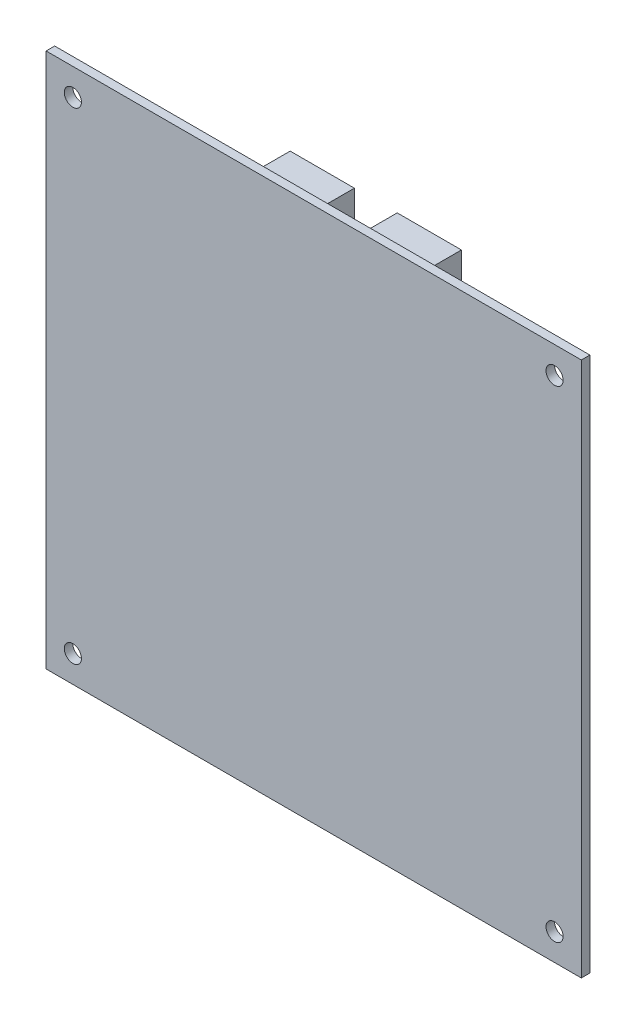
ISO-10303-21;
HEADER;
FILE_DESCRIPTION(('STEP AP214'),'2;1');
FILE_NAME('part.step','',(''),(''),'','','');
FILE_SCHEMA(('AUTOMOTIVE_DESIGN { 1 0 10303 214 1 1 1 1 }'));
ENDSEC;
DATA;
#1=APPLICATION_CONTEXT('core data for automotive mechanical design processes');
#2=APPLICATION_PROTOCOL_DEFINITION('international standard','automotive_design',2000,#1);
#3=PRODUCT_CONTEXT('',#1,'mechanical');
#4=PRODUCT('Part','Part','',(#3));
#5=PRODUCT_RELATED_PRODUCT_CATEGORY('part','',(#4));
#6=PRODUCT_DEFINITION_FORMATION('','',#4);
#7=PRODUCT_DEFINITION_CONTEXT('part definition',#1,'design');
#8=PRODUCT_DEFINITION('design','',#6,#7);
#9=PRODUCT_DEFINITION_SHAPE('','',#8);
#10=(LENGTH_UNIT() NAMED_UNIT(*) SI_UNIT(.MILLI.,.METRE.));
#11=(NAMED_UNIT(*) PLANE_ANGLE_UNIT() SI_UNIT($,.RADIAN.));
#12=(NAMED_UNIT(*) SI_UNIT($,.STERADIAN.) SOLID_ANGLE_UNIT());
#13=UNCERTAINTY_MEASURE_WITH_UNIT(LENGTH_MEASURE(1.E-05),#10,'distance_accuracy_value','');
#14=(GEOMETRIC_REPRESENTATION_CONTEXT(3) GLOBAL_UNCERTAINTY_ASSIGNED_CONTEXT((#13)) GLOBAL_UNIT_ASSIGNED_CONTEXT((#10,
#11,#12)) REPRESENTATION_CONTEXT('',''));
#15=CARTESIAN_POINT('',(0.,0.,0.));
#16=DIRECTION('',(0.,0.,1.));
#17=DIRECTION('',(1.,0.,0.));
#18=AXIS2_PLACEMENT_3D('',#15,#16,#17);
#19=CARTESIAN_POINT('',(0.,0.,0.));
#20=DIRECTION('',(0.,0.,1.));
#21=DIRECTION('',(1.,0.,0.));
#22=AXIS2_PLACEMENT_3D('',#19,#20,#21);
#23=PLANE('',#22);
#24=DIRECTION('',(0.,-1.,0.));
#25=VECTOR('',#24,1.);
#26=CARTESIAN_POINT('',(34.,95.,0.));
#27=LINE('',#26,#25);
#28=CARTESIAN_POINT('',(34.,95.,0.));
#29=VERTEX_POINT('',#28);
#30=CARTESIAN_POINT('',(34.,85.,0.));
#31=VERTEX_POINT('',#30);
#32=EDGE_CURVE('E259',#29,#31,#27,.T.);
#33=ORIENTED_EDGE('',*,*,#32,.T.);
#34=DIRECTION('',(1.,0.,0.));
#35=VECTOR('',#34,1.);
#36=CARTESIAN_POINT('',(34.,85.,0.));
#37=LINE('',#36,#35);
#38=CARTESIAN_POINT('',(46.,85.,0.));
#39=VERTEX_POINT('',#38);
#40=EDGE_CURVE('E261',#31,#39,#37,.T.);
#41=ORIENTED_EDGE('',*,*,#40,.T.);
#42=DIRECTION('',(0.,1.,0.));
#43=VECTOR('',#42,1.);
#44=CARTESIAN_POINT('',(46.,85.,0.));
#45=LINE('',#44,#43);
#46=CARTESIAN_POINT('',(46.,95.,0.));
#47=VERTEX_POINT('',#46);
#48=EDGE_CURVE('E262',#39,#47,#45,.T.);
#49=ORIENTED_EDGE('',*,*,#48,.T.);
#50=DIRECTION('',(-1.,0.,0.));
#51=VECTOR('',#50,1.);
#52=CARTESIAN_POINT('',(46.,95.,0.));
#53=LINE('',#52,#51);
#54=EDGE_CURVE('E266',#47,#29,#53,.T.);
#55=ORIENTED_EDGE('',*,*,#54,.T.);
#56=EDGE_LOOP('',(#33,#41,#49,#55));
#57=FACE_BOUND('',#56,.T.);
#58=DIRECTION('',(0.,-1.,0.));
#59=VECTOR('',#58,1.);
#60=CARTESIAN_POINT('',(34.,73.,0.));
#61=LINE('',#60,#59);
#62=CARTESIAN_POINT('',(34.,73.,0.));
#63=VERTEX_POINT('',#62);
#64=CARTESIAN_POINT('',(34.,26.,0.));
#65=VERTEX_POINT('',#64);
#66=EDGE_CURVE('E320',#63,#65,#61,.T.);
#67=ORIENTED_EDGE('',*,*,#66,.T.);
#68=DIRECTION('',(1.,0.,0.));
#69=VECTOR('',#68,1.);
#70=CARTESIAN_POINT('',(34.,26.,0.));
#71=LINE('',#70,#69);
#72=CARTESIAN_POINT('',(66.,26.,0.));
#73=VERTEX_POINT('',#72);
#74=EDGE_CURVE('E317',#65,#73,#71,.T.);
#75=ORIENTED_EDGE('',*,*,#74,.T.);
#76=DIRECTION('',(0.,1.,0.));
#77=VECTOR('',#76,1.);
#78=CARTESIAN_POINT('',(66.,26.,0.));
#79=LINE('',#78,#77);
#80=CARTESIAN_POINT('',(66.,73.,0.));
#81=VERTEX_POINT('',#80);
#82=EDGE_CURVE('E325',#73,#81,#79,.T.);
#83=ORIENTED_EDGE('',*,*,#82,.T.);
#84=DIRECTION('',(-1.,0.,0.));
#85=VECTOR('',#84,1.);
#86=CARTESIAN_POINT('',(66.,73.,0.));
#87=LINE('',#86,#85);
#88=EDGE_CURVE('E322',#81,#63,#87,.T.);
#89=ORIENTED_EDGE('',*,*,#88,.T.);
#90=EDGE_LOOP('',(#67,#75,#83,#89));
#91=FACE_BOUND('',#90,.T.);
#92=CARTESIAN_POINT('',(95.,95.,0.));
#93=DIRECTION('',(0.,0.,1.));
#94=DIRECTION('',(1.,0.,0.));
#95=AXIS2_PLACEMENT_3D('',#92,#93,#94);
#96=CIRCLE('',#95,1.6);
#97=CARTESIAN_POINT('',(96.6,95.,0.));
#98=VERTEX_POINT('',#97);
#99=EDGE_CURVE('E410',#98,#98,#96,.T.);
#100=ORIENTED_EDGE('',*,*,#99,.T.);
#101=EDGE_LOOP('',(#100));
#102=FACE_BOUND('',#101,.T.);
#103=CARTESIAN_POINT('',(5.,95.,0.));
#104=DIRECTION('',(0.,0.,1.));
#105=DIRECTION('',(1.,0.,0.));
#106=AXIS2_PLACEMENT_3D('',#103,#104,#105);
#107=CIRCLE('',#106,1.6);
#108=CARTESIAN_POINT('',(6.6,95.,0.));
#109=VERTEX_POINT('',#108);
#110=EDGE_CURVE('E411',#109,#109,#107,.T.);
#111=ORIENTED_EDGE('',*,*,#110,.T.);
#112=EDGE_LOOP('',(#111));
#113=FACE_BOUND('',#112,.T.);
#114=CARTESIAN_POINT('',(95.,5.,0.));
#115=DIRECTION('',(0.,0.,1.));
#116=DIRECTION('',(1.,0.,0.));
#117=AXIS2_PLACEMENT_3D('',#114,#115,#116);
#118=CIRCLE('',#117,1.6);
#119=CARTESIAN_POINT('',(96.6,5.,0.));
#120=VERTEX_POINT('',#119);
#121=EDGE_CURVE('E417',#120,#120,#118,.T.);
#122=ORIENTED_EDGE('',*,*,#121,.T.);
#123=EDGE_LOOP('',(#122));
#124=FACE_BOUND('',#123,.T.);
#125=CARTESIAN_POINT('',(5.,5.,0.));
#126=DIRECTION('',(0.,0.,1.));
#127=DIRECTION('',(1.,0.,0.));
#128=AXIS2_PLACEMENT_3D('',#125,#126,#127);
#129=CIRCLE('',#128,1.6);
#130=CARTESIAN_POINT('',(6.6,5.,0.));
#131=VERTEX_POINT('',#130);
#132=EDGE_CURVE('E421',#131,#131,#129,.T.);
#133=ORIENTED_EDGE('',*,*,#132,.T.);
#134=EDGE_LOOP('',(#133));
#135=FACE_BOUND('',#134,.T.);
#136=DIRECTION('',(0.,-1.,0.));
#137=VECTOR('',#136,1.);
#138=CARTESIAN_POINT('',(0.,100.,0.));
#139=LINE('',#138,#137);
#140=CARTESIAN_POINT('',(0.,100.,0.));
#141=VERTEX_POINT('',#140);
#142=CARTESIAN_POINT('',(0.,0.,0.));
#143=VERTEX_POINT('',#142);
#144=EDGE_CURVE('E427',#141,#143,#139,.T.);
#145=ORIENTED_EDGE('',*,*,#144,.F.);
#146=DIRECTION('',(-1.,0.,0.));
#147=VECTOR('',#146,1.);
#148=CARTESIAN_POINT('',(100.,100.,0.));
#149=LINE('',#148,#147);
#150=CARTESIAN_POINT('',(100.,100.,0.));
#151=VERTEX_POINT('',#150);
#152=EDGE_CURVE('E436',#151,#141,#149,.T.);
#153=ORIENTED_EDGE('',*,*,#152,.F.);
#154=DIRECTION('',(0.,1.,0.));
#155=VECTOR('',#154,1.);
#156=CARTESIAN_POINT('',(100.,0.,0.));
#157=LINE('',#156,#155);
#158=CARTESIAN_POINT('',(100.,0.,0.));
#159=VERTEX_POINT('',#158);
#160=EDGE_CURVE('E450',#159,#151,#157,.T.);
#161=ORIENTED_EDGE('',*,*,#160,.F.);
#162=DIRECTION('',(1.,0.,0.));
#163=VECTOR('',#162,1.);
#164=CARTESIAN_POINT('',(0.,0.,0.));
#165=LINE('',#164,#163);
#166=EDGE_CURVE('E443',#143,#159,#165,.T.);
#167=ORIENTED_EDGE('',*,*,#166,.F.);
#168=EDGE_LOOP('',(#145,#153,#161,#167));
#169=FACE_BOUND('',#168,.T.);
#170=DIRECTION('',(-1.,0.,0.));
#171=VECTOR('',#170,1.);
#172=CARTESIAN_POINT('',(30.,78.,0.));
#173=LINE('',#172,#171);
#174=CARTESIAN_POINT('',(30.,78.,0.));
#175=VERTEX_POINT('',#174);
#176=CARTESIAN_POINT('',(26.,78.,0.));
#177=VERTEX_POINT('',#176);
#178=EDGE_CURVE('E384',#175,#177,#173,.T.);
#179=ORIENTED_EDGE('',*,*,#178,.T.);
#180=DIRECTION('',(0.,-1.,0.));
#181=VECTOR('',#180,1.);
#182=CARTESIAN_POINT('',(26.,78.,0.));
#183=LINE('',#182,#181);
#184=CARTESIAN_POINT('',(26.,20.,0.));
#185=VERTEX_POINT('',#184);
#186=EDGE_CURVE('E374',#177,#185,#183,.T.);
#187=ORIENTED_EDGE('',*,*,#186,.T.);
#188=DIRECTION('',(1.,0.,0.));
#189=VECTOR('',#188,1.);
#190=CARTESIAN_POINT('',(26.,20.,0.));
#191=LINE('',#190,#189);
#192=CARTESIAN_POINT('',(30.,20.,0.));
#193=VERTEX_POINT('',#192);
#194=EDGE_CURVE('E378',#185,#193,#191,.T.);
#195=ORIENTED_EDGE('',*,*,#194,.T.);
#196=DIRECTION('',(0.,1.,0.));
#197=VECTOR('',#196,1.);
#198=CARTESIAN_POINT('',(30.,20.,0.));
#199=LINE('',#198,#197);
#200=EDGE_CURVE('E385',#193,#175,#199,.T.);
#201=ORIENTED_EDGE('',*,*,#200,.T.);
#202=EDGE_LOOP('',(#179,#187,#195,#201));
#203=FACE_BOUND('',#202,.T.);
#204=DIRECTION('',(0.,-1.,0.));
#205=VECTOR('',#204,1.);
#206=CARTESIAN_POINT('',(70.,78.,0.));
#207=LINE('',#206,#205);
#208=CARTESIAN_POINT('',(70.,78.,0.));
#209=VERTEX_POINT('',#208);
#210=CARTESIAN_POINT('',(70.,20.,0.));
#211=VERTEX_POINT('',#210);
#212=EDGE_CURVE('E347',#209,#211,#207,.T.);
#213=ORIENTED_EDGE('',*,*,#212,.T.);
#214=DIRECTION('',(1.,0.,0.));
#215=VECTOR('',#214,1.);
#216=CARTESIAN_POINT('',(70.,20.,0.));
#217=LINE('',#216,#215);
#218=CARTESIAN_POINT('',(74.,20.,0.));
#219=VERTEX_POINT('',#218);
#220=EDGE_CURVE('E346',#211,#219,#217,.T.);
#221=ORIENTED_EDGE('',*,*,#220,.T.);
#222=DIRECTION('',(0.,1.,0.));
#223=VECTOR('',#222,1.);
#224=CARTESIAN_POINT('',(74.,20.,0.));
#225=LINE('',#224,#223);
#226=CARTESIAN_POINT('',(74.,78.,0.));
#227=VERTEX_POINT('',#226);
#228=EDGE_CURVE('E352',#219,#227,#225,.T.);
#229=ORIENTED_EDGE('',*,*,#228,.T.);
#230=DIRECTION('',(-1.,0.,0.));
#231=VECTOR('',#230,1.);
#232=CARTESIAN_POINT('',(74.,78.,0.));
#233=LINE('',#232,#231);
#234=EDGE_CURVE('E353',#227,#209,#233,.T.);
#235=ORIENTED_EDGE('',*,*,#234,.T.);
#236=EDGE_LOOP('',(#213,#221,#229,#235));
#237=FACE_BOUND('',#236,.T.);
#238=DIRECTION('',(0.,-1.,0.));
#239=VECTOR('',#238,1.);
#240=CARTESIAN_POINT('',(40.,13.,0.));
#241=LINE('',#240,#239);
#242=CARTESIAN_POINT('',(40.,13.,0.));
#243=VERTEX_POINT('',#242);
#244=CARTESIAN_POINT('',(40.,3.,0.));
#245=VERTEX_POINT('',#244);
#246=EDGE_CURVE('E289',#243,#245,#241,.T.);
#247=ORIENTED_EDGE('',*,*,#246,.T.);
#248=DIRECTION('',(1.,0.,0.));
#249=VECTOR('',#248,1.);
#250=CARTESIAN_POINT('',(40.,3.,0.));
#251=LINE('',#250,#249);
#252=CARTESIAN_POINT('',(60.,3.,0.));
#253=VERTEX_POINT('',#252);
#254=EDGE_CURVE('E290',#245,#253,#251,.T.);
#255=ORIENTED_EDGE('',*,*,#254,.T.);
#256=DIRECTION('',(0.,1.,0.));
#257=VECTOR('',#256,1.);
#258=CARTESIAN_POINT('',(60.,3.,0.));
#259=LINE('',#258,#257);
#260=CARTESIAN_POINT('',(60.,13.,0.));
#261=VERTEX_POINT('',#260);
#262=EDGE_CURVE('E291',#253,#261,#259,.T.);
#263=ORIENTED_EDGE('',*,*,#262,.T.);
#264=DIRECTION('',(-1.,0.,0.));
#265=VECTOR('',#264,1.);
#266=CARTESIAN_POINT('',(60.,13.,0.));
#267=LINE('',#266,#265);
#268=EDGE_CURVE('E293',#261,#243,#267,.T.);
#269=ORIENTED_EDGE('',*,*,#268,.T.);
#270=EDGE_LOOP('',(#247,#255,#263,#269));
#271=FACE_BOUND('',#270,.T.);
#272=DIRECTION('',(0.,-1.,0.));
#273=VECTOR('',#272,1.);
#274=CARTESIAN_POINT('',(54.,95.,0.));
#275=LINE('',#274,#273);
#276=CARTESIAN_POINT('',(54.,95.,0.));
#277=VERTEX_POINT('',#276);
#278=CARTESIAN_POINT('',(54.,85.,0.));
#279=VERTEX_POINT('',#278);
#280=EDGE_CURVE('E57',#277,#279,#275,.T.);
#281=ORIENTED_EDGE('',*,*,#280,.T.);
#282=DIRECTION('',(1.,0.,0.));
#283=VECTOR('',#282,1.);
#284=CARTESIAN_POINT('',(54.,85.,0.));
#285=LINE('',#284,#283);
#286=CARTESIAN_POINT('',(66.,85.,0.));
#287=VERTEX_POINT('',#286);
#288=EDGE_CURVE('E58',#279,#287,#285,.T.);
#289=ORIENTED_EDGE('',*,*,#288,.T.);
#290=DIRECTION('',(0.,1.,0.));
#291=VECTOR('',#290,1.);
#292=CARTESIAN_POINT('',(66.,85.,0.));
#293=LINE('',#292,#291);
#294=CARTESIAN_POINT('',(66.,95.,0.));
#295=VERTEX_POINT('',#294);
#296=EDGE_CURVE('E225',#287,#295,#293,.T.);
#297=ORIENTED_EDGE('',*,*,#296,.T.);
#298=DIRECTION('',(-1.,0.,0.));
#299=VECTOR('',#298,1.);
#300=CARTESIAN_POINT('',(66.,95.,0.));
#301=LINE('',#300,#299);
#302=EDGE_CURVE('E223',#295,#277,#301,.T.);
#303=ORIENTED_EDGE('',*,*,#302,.T.);
#304=EDGE_LOOP('',(#281,#289,#297,#303));
#305=FACE_BOUND('',#304,.T.);
#306=ADVANCED_FACE('F41',(#57,#91,#102,#113,#124,#135,#169,#203,#237,#271,#305),#23,.F.);
#307=CARTESIAN_POINT('',(0.,0.,1.6));
#308=DIRECTION('',(0.,0.,1.));
#309=DIRECTION('',(1.,0.,0.));
#310=AXIS2_PLACEMENT_3D('',#307,#308,#309);
#311=PLANE('',#310);
#312=CARTESIAN_POINT('',(5.,95.,1.6));
#313=DIRECTION('',(0.,0.,1.));
#314=DIRECTION('',(1.,0.,0.));
#315=AXIS2_PLACEMENT_3D('',#312,#313,#314);
#316=CIRCLE('',#315,1.6);
#317=CARTESIAN_POINT('',(6.6,95.,1.6));
#318=VERTEX_POINT('',#317);
#319=EDGE_CURVE('E413',#318,#318,#316,.T.);
#320=ORIENTED_EDGE('',*,*,#319,.F.);
#321=EDGE_LOOP('',(#320));
#322=FACE_BOUND('',#321,.T.);
#323=CARTESIAN_POINT('',(5.,5.,1.6));
#324=DIRECTION('',(0.,0.,1.));
#325=DIRECTION('',(1.,0.,0.));
#326=AXIS2_PLACEMENT_3D('',#323,#324,#325);
#327=CIRCLE('',#326,1.6);
#328=CARTESIAN_POINT('',(6.6,5.,1.6));
#329=VERTEX_POINT('',#328);
#330=EDGE_CURVE('E426',#329,#329,#327,.T.);
#331=ORIENTED_EDGE('',*,*,#330,.F.);
#332=EDGE_LOOP('',(#331));
#333=FACE_BOUND('',#332,.T.);
#334=DIRECTION('',(0.,-1.,0.));
#335=VECTOR('',#334,1.);
#336=CARTESIAN_POINT('',(0.,100.,1.6));
#337=LINE('',#336,#335);
#338=CARTESIAN_POINT('',(0.,100.,1.6));
#339=VERTEX_POINT('',#338);
#340=CARTESIAN_POINT('',(0.,0.,1.6));
#341=VERTEX_POINT('',#340);
#342=EDGE_CURVE('E435',#339,#341,#337,.T.);
#343=ORIENTED_EDGE('',*,*,#342,.T.);
#344=DIRECTION('',(1.,0.,0.));
#345=VECTOR('',#344,1.);
#346=CARTESIAN_POINT('',(0.,0.,1.6));
#347=LINE('',#346,#345);
#348=CARTESIAN_POINT('',(100.,0.,1.6));
#349=VERTEX_POINT('',#348);
#350=EDGE_CURVE('E434',#341,#349,#347,.T.);
#351=ORIENTED_EDGE('',*,*,#350,.T.);
#352=DIRECTION('',(0.,1.,0.));
#353=VECTOR('',#352,1.);
#354=CARTESIAN_POINT('',(100.,0.,1.6));
#355=LINE('',#354,#353);
#356=CARTESIAN_POINT('',(100.,100.,1.6));
#357=VERTEX_POINT('',#356);
#358=EDGE_CURVE('E437',#349,#357,#355,.T.);
#359=ORIENTED_EDGE('',*,*,#358,.T.);
#360=DIRECTION('',(-1.,0.,0.));
#361=VECTOR('',#360,1.);
#362=CARTESIAN_POINT('',(100.,100.,1.6));
#363=LINE('',#362,#361);
#364=EDGE_CURVE('E439',#357,#339,#363,.T.);
#365=ORIENTED_EDGE('',*,*,#364,.T.);
#366=EDGE_LOOP('',(#343,#351,#359,#365));
#367=FACE_BOUND('',#366,.T.);
#368=CARTESIAN_POINT('',(95.,5.,1.6));
#369=DIRECTION('',(0.,0.,1.));
#370=DIRECTION('',(1.,0.,0.));
#371=AXIS2_PLACEMENT_3D('',#368,#369,#370);
#372=CIRCLE('',#371,1.6);
#373=CARTESIAN_POINT('',(96.6,5.,1.6));
#374=VERTEX_POINT('',#373);
#375=EDGE_CURVE('E419',#374,#374,#372,.T.);
#376=ORIENTED_EDGE('',*,*,#375,.F.);
#377=EDGE_LOOP('',(#376));
#378=FACE_BOUND('',#377,.T.);
#379=CARTESIAN_POINT('',(95.,95.,1.6));
#380=DIRECTION('',(0.,0.,1.));
#381=DIRECTION('',(1.,0.,0.));
#382=AXIS2_PLACEMENT_3D('',#379,#380,#381);
#383=CIRCLE('',#382,1.6);
#384=CARTESIAN_POINT('',(96.6,95.,1.6));
#385=VERTEX_POINT('',#384);
#386=EDGE_CURVE('E408',#385,#385,#383,.T.);
#387=ORIENTED_EDGE('',*,*,#386,.F.);
#388=EDGE_LOOP('',(#387));
#389=FACE_BOUND('',#388,.T.);
#390=ADVANCED_FACE('F475',(#322,#333,#367,#378,#389),#311,.T.);
#391=CARTESIAN_POINT('',(0.,100.,1.6));
#392=DIRECTION('',(1.,0.,0.));
#393=DIRECTION('',(0.,0.,-1.));
#394=AXIS2_PLACEMENT_3D('',#391,#392,#393);
#395=PLANE('',#394);
#396=ORIENTED_EDGE('',*,*,#144,.T.);
#397=DIRECTION('',(0.,0.,-1.));
#398=VECTOR('',#397,1.);
#399=CARTESIAN_POINT('',(0.,0.,1.6));
#400=LINE('',#399,#398);
#401=EDGE_CURVE('E11',#341,#143,#400,.T.);
#402=ORIENTED_EDGE('',*,*,#401,.F.);
#403=ORIENTED_EDGE('',*,*,#342,.F.);
#404=DIRECTION('',(0.,0.,-1.));
#405=VECTOR('',#404,1.);
#406=CARTESIAN_POINT('',(0.,100.,1.6));
#407=LINE('',#406,#405);
#408=EDGE_CURVE('E445',#339,#141,#407,.T.);
#409=ORIENTED_EDGE('',*,*,#408,.T.);
#410=EDGE_LOOP('',(#396,#402,#403,#409));
#411=FACE_BOUND('',#410,.T.);
#412=ADVANCED_FACE('F43',(#411),#395,.F.);
#413=CARTESIAN_POINT('',(0.,0.,1.6));
#414=DIRECTION('',(0.,1.,0.));
#415=DIRECTION('',(0.,0.,1.));
#416=AXIS2_PLACEMENT_3D('',#413,#414,#415);
#417=PLANE('',#416);
#418=ORIENTED_EDGE('',*,*,#166,.T.);
#419=DIRECTION('',(0.,0.,-1.));
#420=VECTOR('',#419,1.);
#421=CARTESIAN_POINT('',(100.,0.,1.6));
#422=LINE('',#421,#420);
#423=EDGE_CURVE('E47',#349,#159,#422,.T.);
#424=ORIENTED_EDGE('',*,*,#423,.F.);
#425=ORIENTED_EDGE('',*,*,#350,.F.);
#426=ORIENTED_EDGE('',*,*,#401,.T.);
#427=EDGE_LOOP('',(#418,#424,#425,#426));
#428=FACE_BOUND('',#427,.T.);
#429=ADVANCED_FACE('F478',(#428),#417,.F.);
#430=CARTESIAN_POINT('',(100.,0.,1.6));
#431=DIRECTION('',(-1.,0.,0.));
#432=DIRECTION('',(0.,0.,1.));
#433=AXIS2_PLACEMENT_3D('',#430,#431,#432);
#434=PLANE('',#433);
#435=ORIENTED_EDGE('',*,*,#160,.T.);
#436=DIRECTION('',(0.,0.,-1.));
#437=VECTOR('',#436,1.);
#438=CARTESIAN_POINT('',(100.,100.,1.6));
#439=LINE('',#438,#437);
#440=EDGE_CURVE('E452',#357,#151,#439,.T.);
#441=ORIENTED_EDGE('',*,*,#440,.F.);
#442=ORIENTED_EDGE('',*,*,#358,.F.);
#443=ORIENTED_EDGE('',*,*,#423,.T.);
#444=EDGE_LOOP('',(#435,#441,#442,#443));
#445=FACE_BOUND('',#444,.T.);
#446=ADVANCED_FACE('F459',(#445),#434,.F.);
#447=CARTESIAN_POINT('',(100.,100.,1.6));
#448=DIRECTION('',(0.,-1.,0.));
#449=DIRECTION('',(0.,0.,-1.));
#450=AXIS2_PLACEMENT_3D('',#447,#448,#449);
#451=PLANE('',#450);
#452=ORIENTED_EDGE('',*,*,#152,.T.);
#453=ORIENTED_EDGE('',*,*,#408,.F.);
#454=ORIENTED_EDGE('',*,*,#364,.F.);
#455=ORIENTED_EDGE('',*,*,#440,.T.);
#456=EDGE_LOOP('',(#452,#453,#454,#455));
#457=FACE_BOUND('',#456,.T.);
#458=ADVANCED_FACE('F469',(#457),#451,.F.);
#459=CARTESIAN_POINT('',(5.,5.,1.6));
#460=DIRECTION('',(0.,0.,-1.));
#461=DIRECTION('',(-1.,0.,0.));
#462=AXIS2_PLACEMENT_3D('',#459,#460,#461);
#463=CYLINDRICAL_SURFACE('',#462,1.6);
#464=ORIENTED_EDGE('',*,*,#330,.T.);
#465=EDGE_LOOP('',(#464));
#466=FACE_BOUND('',#465,.T.);
#467=ORIENTED_EDGE('',*,*,#132,.F.);
#468=EDGE_LOOP('',(#467));
#469=FACE_BOUND('',#468,.T.);
#470=ADVANCED_FACE('F500',(#466,#469),#463,.F.);
#471=CARTESIAN_POINT('',(95.,5.,1.6));
#472=DIRECTION('',(0.,0.,-1.));
#473=DIRECTION('',(-1.,0.,0.));
#474=AXIS2_PLACEMENT_3D('',#471,#472,#473);
#475=CYLINDRICAL_SURFACE('',#474,1.6);
#476=ORIENTED_EDGE('',*,*,#375,.T.);
#477=EDGE_LOOP('',(#476));
#478=FACE_BOUND('',#477,.T.);
#479=ORIENTED_EDGE('',*,*,#121,.F.);
#480=EDGE_LOOP('',(#479));
#481=FACE_BOUND('',#480,.T.);
#482=ADVANCED_FACE('F502',(#478,#481),#475,.F.);
#483=CARTESIAN_POINT('',(5.,95.,1.6));
#484=DIRECTION('',(0.,0.,-1.));
#485=DIRECTION('',(-1.,0.,0.));
#486=AXIS2_PLACEMENT_3D('',#483,#484,#485);
#487=CYLINDRICAL_SURFACE('',#486,1.6);
#488=ORIENTED_EDGE('',*,*,#319,.T.);
#489=EDGE_LOOP('',(#488));
#490=FACE_BOUND('',#489,.T.);
#491=ORIENTED_EDGE('',*,*,#110,.F.);
#492=EDGE_LOOP('',(#491));
#493=FACE_BOUND('',#492,.T.);
#494=ADVANCED_FACE('F506',(#490,#493),#487,.F.);
#495=CARTESIAN_POINT('',(95.,95.,1.6));
#496=DIRECTION('',(0.,0.,-1.));
#497=DIRECTION('',(-1.,0.,0.));
#498=AXIS2_PLACEMENT_3D('',#495,#496,#497);
#499=CYLINDRICAL_SURFACE('',#498,1.6);
#500=ORIENTED_EDGE('',*,*,#386,.T.);
#501=EDGE_LOOP('',(#500));
#502=FACE_BOUND('',#501,.T.);
#503=ORIENTED_EDGE('',*,*,#99,.F.);
#504=EDGE_LOOP('',(#503));
#505=FACE_BOUND('',#504,.T.);
#506=ADVANCED_FACE('F511',(#502,#505),#499,.F.);
#507=CARTESIAN_POINT('',(26.,78.,0.));
#508=DIRECTION('',(1.,0.,0.));
#509=DIRECTION('',(0.,0.,-1.));
#510=AXIS2_PLACEMENT_3D('',#507,#508,#509);
#511=PLANE('',#510);
#512=DIRECTION('',(0.,-1.,0.));
#513=VECTOR('',#512,1.);
#514=CARTESIAN_POINT('',(26.,78.,-8.));
#515=LINE('',#514,#513);
#516=CARTESIAN_POINT('',(26.,78.,-8.));
#517=VERTEX_POINT('',#516);
#518=CARTESIAN_POINT('',(26.,20.,-8.));
#519=VERTEX_POINT('',#518);
#520=EDGE_CURVE('E372',#517,#519,#515,.T.);
#521=ORIENTED_EDGE('',*,*,#520,.T.);
#522=DIRECTION('',(0.,0.,-1.));
#523=VECTOR('',#522,1.);
#524=CARTESIAN_POINT('',(26.,20.,0.));
#525=LINE('',#524,#523);
#526=EDGE_CURVE('E404',#185,#519,#525,.T.);
#527=ORIENTED_EDGE('',*,*,#526,.F.);
#528=ORIENTED_EDGE('',*,*,#186,.F.);
#529=DIRECTION('',(0.,0.,-1.));
#530=VECTOR('',#529,1.);
#531=CARTESIAN_POINT('',(26.,78.,0.));
#532=LINE('',#531,#530);
#533=EDGE_CURVE('E389',#177,#517,#532,.T.);
#534=ORIENTED_EDGE('',*,*,#533,.T.);
#535=EDGE_LOOP('',(#521,#527,#528,#534));
#536=FACE_BOUND('',#535,.T.);
#537=ADVANCED_FACE('F520',(#536),#511,.F.);
#538=CARTESIAN_POINT('',(26.,20.,0.));
#539=DIRECTION('',(0.,1.,0.));
#540=DIRECTION('',(0.,0.,1.));
#541=AXIS2_PLACEMENT_3D('',#538,#539,#540);
#542=PLANE('',#541);
#543=DIRECTION('',(1.,0.,0.));
#544=VECTOR('',#543,1.);
#545=CARTESIAN_POINT('',(26.,20.,-8.));
#546=LINE('',#545,#544);
#547=CARTESIAN_POINT('',(30.,20.,-8.));
#548=VERTEX_POINT('',#547);
#549=EDGE_CURVE('E392',#519,#548,#546,.T.);
#550=ORIENTED_EDGE('',*,*,#549,.T.);
#551=DIRECTION('',(0.,0.,-1.));
#552=VECTOR('',#551,1.);
#553=CARTESIAN_POINT('',(30.,20.,0.));
#554=LINE('',#553,#552);
#555=EDGE_CURVE('E402',#193,#548,#554,.T.);
#556=ORIENTED_EDGE('',*,*,#555,.F.);
#557=ORIENTED_EDGE('',*,*,#194,.F.);
#558=ORIENTED_EDGE('',*,*,#526,.T.);
#559=EDGE_LOOP('',(#550,#556,#557,#558));
#560=FACE_BOUND('',#559,.T.);
#561=ADVANCED_FACE('F521',(#560),#542,.F.);
#562=CARTESIAN_POINT('',(30.,20.,0.));
#563=DIRECTION('',(-1.,0.,0.));
#564=DIRECTION('',(0.,0.,1.));
#565=AXIS2_PLACEMENT_3D('',#562,#563,#564);
#566=PLANE('',#565);
#567=DIRECTION('',(0.,1.,0.));
#568=VECTOR('',#567,1.);
#569=CARTESIAN_POINT('',(30.,20.,-8.));
#570=LINE('',#569,#568);
#571=CARTESIAN_POINT('',(30.,78.,-8.));
#572=VERTEX_POINT('',#571);
#573=EDGE_CURVE('E393',#548,#572,#570,.T.);
#574=ORIENTED_EDGE('',*,*,#573,.T.);
#575=DIRECTION('',(0.,0.,-1.));
#576=VECTOR('',#575,1.);
#577=CARTESIAN_POINT('',(30.,78.,0.));
#578=LINE('',#577,#576);
#579=EDGE_CURVE('E399',#175,#572,#578,.T.);
#580=ORIENTED_EDGE('',*,*,#579,.F.);
#581=ORIENTED_EDGE('',*,*,#200,.F.);
#582=ORIENTED_EDGE('',*,*,#555,.T.);
#583=EDGE_LOOP('',(#574,#580,#581,#582));
#584=FACE_BOUND('',#583,.T.);
#585=ADVANCED_FACE('F525',(#584),#566,.F.);
#586=CARTESIAN_POINT('',(30.,78.,0.));
#587=DIRECTION('',(0.,-1.,0.));
#588=DIRECTION('',(0.,0.,-1.));
#589=AXIS2_PLACEMENT_3D('',#586,#587,#588);
#590=PLANE('',#589);
#591=DIRECTION('',(-1.,0.,0.));
#592=VECTOR('',#591,1.);
#593=CARTESIAN_POINT('',(30.,78.,-8.));
#594=LINE('',#593,#592);
#595=EDGE_CURVE('E377',#572,#517,#594,.T.);
#596=ORIENTED_EDGE('',*,*,#595,.T.);
#597=ORIENTED_EDGE('',*,*,#533,.F.);
#598=ORIENTED_EDGE('',*,*,#178,.F.);
#599=ORIENTED_EDGE('',*,*,#579,.T.);
#600=EDGE_LOOP('',(#596,#597,#598,#599));
#601=FACE_BOUND('',#600,.T.);
#602=ADVANCED_FACE('F530',(#601),#590,.F.);
#603=CARTESIAN_POINT('',(0.,0.,-8.));
#604=DIRECTION('',(0.,0.,1.));
#605=DIRECTION('',(1.,0.,0.));
#606=AXIS2_PLACEMENT_3D('',#603,#604,#605);
#607=PLANE('',#606);
#608=ORIENTED_EDGE('',*,*,#520,.F.);
#609=ORIENTED_EDGE('',*,*,#595,.F.);
#610=ORIENTED_EDGE('',*,*,#573,.F.);
#611=ORIENTED_EDGE('',*,*,#549,.F.);
#612=EDGE_LOOP('',(#608,#609,#610,#611));
#613=FACE_BOUND('',#612,.T.);
#614=ADVANCED_FACE('F531',(#613),#607,.F.);
#615=CARTESIAN_POINT('',(70.,78.,0.));
#616=DIRECTION('',(1.,0.,0.));
#617=DIRECTION('',(0.,0.,-1.));
#618=AXIS2_PLACEMENT_3D('',#615,#616,#617);
#619=PLANE('',#618);
#620=DIRECTION('',(0.,-1.,0.));
#621=VECTOR('',#620,1.);
#622=CARTESIAN_POINT('',(70.,78.,-8.));
#623=LINE('',#622,#621);
#624=CARTESIAN_POINT('',(70.,78.,-8.));
#625=VERTEX_POINT('',#624);
#626=CARTESIAN_POINT('',(70.,20.,-8.));
#627=VERTEX_POINT('',#626);
#628=EDGE_CURVE('E345',#625,#627,#623,.T.);
#629=ORIENTED_EDGE('',*,*,#628,.T.);
#630=DIRECTION('',(0.,0.,-1.));
#631=VECTOR('',#630,1.);
#632=CARTESIAN_POINT('',(70.,20.,0.));
#633=LINE('',#632,#631);
#634=EDGE_CURVE('E371',#211,#627,#633,.T.);
#635=ORIENTED_EDGE('',*,*,#634,.F.);
#636=ORIENTED_EDGE('',*,*,#212,.F.);
#637=DIRECTION('',(0.,0.,-1.));
#638=VECTOR('',#637,1.);
#639=CARTESIAN_POINT('',(70.,78.,0.));
#640=LINE('',#639,#638);
#641=EDGE_CURVE('E351',#209,#625,#640,.T.);
#642=ORIENTED_EDGE('',*,*,#641,.T.);
#643=EDGE_LOOP('',(#629,#635,#636,#642));
#644=FACE_BOUND('',#643,.T.);
#645=ADVANCED_FACE('F540',(#644),#619,.F.);
#646=CARTESIAN_POINT('',(70.,20.,0.));
#647=DIRECTION('',(0.,1.,0.));
#648=DIRECTION('',(0.,0.,1.));
#649=AXIS2_PLACEMENT_3D('',#646,#647,#648);
#650=PLANE('',#649);
#651=DIRECTION('',(1.,0.,0.));
#652=VECTOR('',#651,1.);
#653=CARTESIAN_POINT('',(70.,20.,-8.));
#654=LINE('',#653,#652);
#655=CARTESIAN_POINT('',(74.,20.,-8.));
#656=VERTEX_POINT('',#655);
#657=EDGE_CURVE('E359',#627,#656,#654,.T.);
#658=ORIENTED_EDGE('',*,*,#657,.T.);
#659=DIRECTION('',(0.,0.,-1.));
#660=VECTOR('',#659,1.);
#661=CARTESIAN_POINT('',(74.,20.,0.));
#662=LINE('',#661,#660);
#663=EDGE_CURVE('E366',#219,#656,#662,.T.);
#664=ORIENTED_EDGE('',*,*,#663,.F.);
#665=ORIENTED_EDGE('',*,*,#220,.F.);
#666=ORIENTED_EDGE('',*,*,#634,.T.);
#667=EDGE_LOOP('',(#658,#664,#665,#666));
#668=FACE_BOUND('',#667,.T.);
#669=ADVANCED_FACE('F541',(#668),#650,.F.);
#670=CARTESIAN_POINT('',(74.,20.,0.));
#671=DIRECTION('',(-1.,0.,0.));
#672=DIRECTION('',(0.,0.,1.));
#673=AXIS2_PLACEMENT_3D('',#670,#671,#672);
#674=PLANE('',#673);
#675=DIRECTION('',(0.,1.,0.));
#676=VECTOR('',#675,1.);
#677=CARTESIAN_POINT('',(74.,20.,-8.));
#678=LINE('',#677,#676);
#679=CARTESIAN_POINT('',(74.,78.,-8.));
#680=VERTEX_POINT('',#679);
#681=EDGE_CURVE('E360',#656,#680,#678,.T.);
#682=ORIENTED_EDGE('',*,*,#681,.T.);
#683=DIRECTION('',(0.,0.,-1.));
#684=VECTOR('',#683,1.);
#685=CARTESIAN_POINT('',(74.,78.,0.));
#686=LINE('',#685,#684);
#687=EDGE_CURVE('E364',#227,#680,#686,.T.);
#688=ORIENTED_EDGE('',*,*,#687,.F.);
#689=ORIENTED_EDGE('',*,*,#228,.F.);
#690=ORIENTED_EDGE('',*,*,#663,.T.);
#691=EDGE_LOOP('',(#682,#688,#689,#690));
#692=FACE_BOUND('',#691,.T.);
#693=ADVANCED_FACE('F544',(#692),#674,.F.);
#694=CARTESIAN_POINT('',(74.,78.,0.));
#695=DIRECTION('',(0.,-1.,0.));
#696=DIRECTION('',(0.,0.,-1.));
#697=AXIS2_PLACEMENT_3D('',#694,#695,#696);
#698=PLANE('',#697);
#699=DIRECTION('',(-1.,0.,0.));
#700=VECTOR('',#699,1.);
#701=CARTESIAN_POINT('',(74.,78.,-8.));
#702=LINE('',#701,#700);
#703=EDGE_CURVE('E349',#680,#625,#702,.T.);
#704=ORIENTED_EDGE('',*,*,#703,.T.);
#705=ORIENTED_EDGE('',*,*,#641,.F.);
#706=ORIENTED_EDGE('',*,*,#234,.F.);
#707=ORIENTED_EDGE('',*,*,#687,.T.);
#708=EDGE_LOOP('',(#704,#705,#706,#707));
#709=FACE_BOUND('',#708,.T.);
#710=ADVANCED_FACE('F548',(#709),#698,.F.);
#711=CARTESIAN_POINT('',(0.,0.,-8.));
#712=DIRECTION('',(0.,0.,1.));
#713=DIRECTION('',(1.,0.,0.));
#714=AXIS2_PLACEMENT_3D('',#711,#712,#713);
#715=PLANE('',#714);
#716=ORIENTED_EDGE('',*,*,#628,.F.);
#717=ORIENTED_EDGE('',*,*,#703,.F.);
#718=ORIENTED_EDGE('',*,*,#681,.F.);
#719=ORIENTED_EDGE('',*,*,#657,.F.);
#720=EDGE_LOOP('',(#716,#717,#718,#719));
#721=FACE_BOUND('',#720,.T.);
#722=ADVANCED_FACE('F554',(#721),#715,.F.);
#723=CARTESIAN_POINT('',(34.,73.,0.));
#724=DIRECTION('',(1.,0.,0.));
#725=DIRECTION('',(0.,0.,-1.));
#726=AXIS2_PLACEMENT_3D('',#723,#724,#725);
#727=PLANE('',#726);
#728=DIRECTION('',(0.,-1.,0.));
#729=VECTOR('',#728,1.);
#730=CARTESIAN_POINT('',(34.,73.,-16.));
#731=LINE('',#730,#729);
#732=CARTESIAN_POINT('',(34.,73.,-16.));
#733=VERTEX_POINT('',#732);
#734=CARTESIAN_POINT('',(34.,26.,-16.));
#735=VERTEX_POINT('',#734);
#736=EDGE_CURVE('E316',#733,#735,#731,.T.);
#737=ORIENTED_EDGE('',*,*,#736,.T.);
#738=DIRECTION('',(0.,0.,-1.));
#739=VECTOR('',#738,1.);
#740=CARTESIAN_POINT('',(34.,26.,0.));
#741=LINE('',#740,#739);
#742=EDGE_CURVE('E342',#65,#735,#741,.T.);
#743=ORIENTED_EDGE('',*,*,#742,.F.);
#744=ORIENTED_EDGE('',*,*,#66,.F.);
#745=DIRECTION('',(0.,0.,-1.));
#746=VECTOR('',#745,1.);
#747=CARTESIAN_POINT('',(34.,73.,0.));
#748=LINE('',#747,#746);
#749=EDGE_CURVE('E326',#63,#733,#748,.T.);
#750=ORIENTED_EDGE('',*,*,#749,.T.);
#751=EDGE_LOOP('',(#737,#743,#744,#750));
#752=FACE_BOUND('',#751,.T.);
#753=ADVANCED_FACE('F560',(#752),#727,.F.);
#754=CARTESIAN_POINT('',(34.,26.,0.));
#755=DIRECTION('',(0.,1.,0.));
#756=DIRECTION('',(0.,0.,1.));
#757=AXIS2_PLACEMENT_3D('',#754,#755,#756);
#758=PLANE('',#757);
#759=DIRECTION('',(1.,0.,0.));
#760=VECTOR('',#759,1.);
#761=CARTESIAN_POINT('',(34.,26.,-16.));
#762=LINE('',#761,#760);
#763=CARTESIAN_POINT('',(66.,26.,-16.));
#764=VERTEX_POINT('',#763);
#765=EDGE_CURVE('E328',#735,#764,#762,.T.);
#766=ORIENTED_EDGE('',*,*,#765,.T.);
#767=DIRECTION('',(0.,0.,-1.));
#768=VECTOR('',#767,1.);
#769=CARTESIAN_POINT('',(66.,26.,0.));
#770=LINE('',#769,#768);
#771=EDGE_CURVE('E339',#73,#764,#770,.T.);
#772=ORIENTED_EDGE('',*,*,#771,.F.);
#773=ORIENTED_EDGE('',*,*,#74,.F.);
#774=ORIENTED_EDGE('',*,*,#742,.T.);
#775=EDGE_LOOP('',(#766,#772,#773,#774));
#776=FACE_BOUND('',#775,.T.);
#777=ADVANCED_FACE('F561',(#776),#758,.F.);
#778=CARTESIAN_POINT('',(66.,26.,0.));
#779=DIRECTION('',(-1.,0.,0.));
#780=DIRECTION('',(0.,0.,1.));
#781=AXIS2_PLACEMENT_3D('',#778,#779,#780);
#782=PLANE('',#781);
#783=DIRECTION('',(0.,1.,0.));
#784=VECTOR('',#783,1.);
#785=CARTESIAN_POINT('',(66.,26.,-16.));
#786=LINE('',#785,#784);
#787=CARTESIAN_POINT('',(66.,73.,-16.));
#788=VERTEX_POINT('',#787);
#789=EDGE_CURVE('E332',#764,#788,#786,.T.);
#790=ORIENTED_EDGE('',*,*,#789,.T.);
#791=DIRECTION('',(0.,0.,-1.));
#792=VECTOR('',#791,1.);
#793=CARTESIAN_POINT('',(66.,73.,0.));
#794=LINE('',#793,#792);
#795=EDGE_CURVE('E337',#81,#788,#794,.T.);
#796=ORIENTED_EDGE('',*,*,#795,.F.);
#797=ORIENTED_EDGE('',*,*,#82,.F.);
#798=ORIENTED_EDGE('',*,*,#771,.T.);
#799=EDGE_LOOP('',(#790,#796,#797,#798));
#800=FACE_BOUND('',#799,.T.);
#801=ADVANCED_FACE('F565',(#800),#782,.F.);
#802=CARTESIAN_POINT('',(66.,73.,0.));
#803=DIRECTION('',(0.,-1.,0.));
#804=DIRECTION('',(0.,0.,-1.));
#805=AXIS2_PLACEMENT_3D('',#802,#803,#804);
#806=PLANE('',#805);
#807=DIRECTION('',(-1.,0.,0.));
#808=VECTOR('',#807,1.);
#809=CARTESIAN_POINT('',(66.,73.,-16.));
#810=LINE('',#809,#808);
#811=EDGE_CURVE('E319',#788,#733,#810,.T.);
#812=ORIENTED_EDGE('',*,*,#811,.T.);
#813=ORIENTED_EDGE('',*,*,#749,.F.);
#814=ORIENTED_EDGE('',*,*,#88,.F.);
#815=ORIENTED_EDGE('',*,*,#795,.T.);
#816=EDGE_LOOP('',(#812,#813,#814,#815));
#817=FACE_BOUND('',#816,.T.);
#818=ADVANCED_FACE('F569',(#817),#806,.F.);
#819=CARTESIAN_POINT('',(0.,0.,-16.));
#820=DIRECTION('',(0.,0.,1.));
#821=DIRECTION('',(1.,0.,0.));
#822=AXIS2_PLACEMENT_3D('',#819,#820,#821);
#823=PLANE('',#822);
#824=ORIENTED_EDGE('',*,*,#736,.F.);
#825=ORIENTED_EDGE('',*,*,#811,.F.);
#826=ORIENTED_EDGE('',*,*,#789,.F.);
#827=ORIENTED_EDGE('',*,*,#765,.F.);
#828=EDGE_LOOP('',(#824,#825,#826,#827));
#829=FACE_BOUND('',#828,.T.);
#830=ADVANCED_FACE('F573',(#829),#823,.F.);
#831=CARTESIAN_POINT('',(40.,13.,0.));
#832=DIRECTION('',(1.,0.,0.));
#833=DIRECTION('',(0.,0.,-1.));
#834=AXIS2_PLACEMENT_3D('',#831,#832,#833);
#835=PLANE('',#834);
#836=DIRECTION('',(0.,-1.,0.));
#837=VECTOR('',#836,1.);
#838=CARTESIAN_POINT('',(40.,13.,-12.));
#839=LINE('',#838,#837);
#840=CARTESIAN_POINT('',(40.,13.,-12.));
#841=VERTEX_POINT('',#840);
#842=CARTESIAN_POINT('',(40.,3.,-12.));
#843=VERTEX_POINT('',#842);
#844=EDGE_CURVE('E287',#841,#843,#839,.T.);
#845=ORIENTED_EDGE('',*,*,#844,.T.);
#846=DIRECTION('',(0.,0.,-1.));
#847=VECTOR('',#846,1.);
#848=CARTESIAN_POINT('',(40.,3.,0.));
#849=LINE('',#848,#847);
#850=EDGE_CURVE('E311',#245,#843,#849,.T.);
#851=ORIENTED_EDGE('',*,*,#850,.F.);
#852=ORIENTED_EDGE('',*,*,#246,.F.);
#853=DIRECTION('',(0.,0.,-1.));
#854=VECTOR('',#853,1.);
#855=CARTESIAN_POINT('',(40.,13.,0.));
#856=LINE('',#855,#854);
#857=EDGE_CURVE('E300',#243,#841,#856,.T.);
#858=ORIENTED_EDGE('',*,*,#857,.T.);
#859=EDGE_LOOP('',(#845,#851,#852,#858));
#860=FACE_BOUND('',#859,.T.);
#861=ADVANCED_FACE('F577',(#860),#835,.F.);
#862=CARTESIAN_POINT('',(40.,3.,0.));
#863=DIRECTION('',(0.,1.,0.));
#864=DIRECTION('',(0.,0.,1.));
#865=AXIS2_PLACEMENT_3D('',#862,#863,#864);
#866=PLANE('',#865);
#867=DIRECTION('',(1.,0.,0.));
#868=VECTOR('',#867,1.);
#869=CARTESIAN_POINT('',(40.,3.,-12.));
#870=LINE('',#869,#868);
#871=CARTESIAN_POINT('',(60.,3.,-12.));
#872=VERTEX_POINT('',#871);
#873=EDGE_CURVE('E296',#843,#872,#870,.T.);
#874=ORIENTED_EDGE('',*,*,#873,.T.);
#875=DIRECTION('',(0.,0.,-1.));
#876=VECTOR('',#875,1.);
#877=CARTESIAN_POINT('',(60.,3.,0.));
#878=LINE('',#877,#876);
#879=EDGE_CURVE('E309',#253,#872,#878,.T.);
#880=ORIENTED_EDGE('',*,*,#879,.F.);
#881=ORIENTED_EDGE('',*,*,#254,.F.);
#882=ORIENTED_EDGE('',*,*,#850,.T.);
#883=EDGE_LOOP('',(#874,#880,#881,#882));
#884=FACE_BOUND('',#883,.T.);
#885=ADVANCED_FACE('F583',(#884),#866,.F.);
#886=CARTESIAN_POINT('',(60.,3.,0.));
#887=DIRECTION('',(-1.,0.,0.));
#888=DIRECTION('',(0.,0.,1.));
#889=AXIS2_PLACEMENT_3D('',#886,#887,#888);
#890=PLANE('',#889);
#891=DIRECTION('',(0.,1.,0.));
#892=VECTOR('',#891,1.);
#893=CARTESIAN_POINT('',(60.,3.,-12.));
#894=LINE('',#893,#892);
#895=CARTESIAN_POINT('',(60.,13.,-12.));
#896=VERTEX_POINT('',#895);
#897=EDGE_CURVE('E302',#872,#896,#894,.T.);
#898=ORIENTED_EDGE('',*,*,#897,.T.);
#899=DIRECTION('',(0.,0.,-1.));
#900=VECTOR('',#899,1.);
#901=CARTESIAN_POINT('',(60.,13.,0.));
#902=LINE('',#901,#900);
#903=EDGE_CURVE('E307',#261,#896,#902,.T.);
#904=ORIENTED_EDGE('',*,*,#903,.F.);
#905=ORIENTED_EDGE('',*,*,#262,.F.);
#906=ORIENTED_EDGE('',*,*,#879,.T.);
#907=EDGE_LOOP('',(#898,#904,#905,#906));
#908=FACE_BOUND('',#907,.T.);
#909=ADVANCED_FACE('F584',(#908),#890,.F.);
#910=CARTESIAN_POINT('',(60.,13.,0.));
#911=DIRECTION('',(0.,-1.,0.));
#912=DIRECTION('',(0.,0.,-1.));
#913=AXIS2_PLACEMENT_3D('',#910,#911,#912);
#914=PLANE('',#913);
#915=DIRECTION('',(-1.,0.,0.));
#916=VECTOR('',#915,1.);
#917=CARTESIAN_POINT('',(60.,13.,-12.));
#918=LINE('',#917,#916);
#919=EDGE_CURVE('E292',#896,#841,#918,.T.);
#920=ORIENTED_EDGE('',*,*,#919,.T.);
#921=ORIENTED_EDGE('',*,*,#857,.F.);
#922=ORIENTED_EDGE('',*,*,#268,.F.);
#923=ORIENTED_EDGE('',*,*,#903,.T.);
#924=EDGE_LOOP('',(#920,#921,#922,#923));
#925=FACE_BOUND('',#924,.T.);
#926=ADVANCED_FACE('F589',(#925),#914,.F.);
#927=CARTESIAN_POINT('',(0.,0.,-12.));
#928=DIRECTION('',(0.,0.,1.));
#929=DIRECTION('',(1.,0.,0.));
#930=AXIS2_PLACEMENT_3D('',#927,#928,#929);
#931=PLANE('',#930);
#932=ORIENTED_EDGE('',*,*,#844,.F.);
#933=ORIENTED_EDGE('',*,*,#919,.F.);
#934=ORIENTED_EDGE('',*,*,#897,.F.);
#935=ORIENTED_EDGE('',*,*,#873,.F.);
#936=EDGE_LOOP('',(#932,#933,#934,#935));
#937=FACE_BOUND('',#936,.T.);
#938=ADVANCED_FACE('F593',(#937),#931,.F.);
#939=CARTESIAN_POINT('',(34.,95.,0.));
#940=DIRECTION('',(1.,0.,0.));
#941=DIRECTION('',(0.,0.,-1.));
#942=AXIS2_PLACEMENT_3D('',#939,#940,#941);
#943=PLANE('',#942);
#944=DIRECTION('',(0.,-1.,0.));
#945=VECTOR('',#944,1.);
#946=CARTESIAN_POINT('',(34.,95.,-10.));
#947=LINE('',#946,#945);
#948=CARTESIAN_POINT('',(34.,95.,-10.));
#949=VERTEX_POINT('',#948);
#950=CARTESIAN_POINT('',(34.,85.,-10.));
#951=VERTEX_POINT('',#950);
#952=EDGE_CURVE('E256',#949,#951,#947,.T.);
#953=ORIENTED_EDGE('',*,*,#952,.T.);
#954=DIRECTION('',(0.,0.,-1.));
#955=VECTOR('',#954,1.);
#956=CARTESIAN_POINT('',(34.,85.,0.));
#957=LINE('',#956,#955);
#958=EDGE_CURVE('E284',#31,#951,#957,.T.);
#959=ORIENTED_EDGE('',*,*,#958,.F.);
#960=ORIENTED_EDGE('',*,*,#32,.F.);
#961=DIRECTION('',(0.,0.,-1.));
#962=VECTOR('',#961,1.);
#963=CARTESIAN_POINT('',(34.,95.,0.));
#964=LINE('',#963,#962);
#965=EDGE_CURVE('E268',#29,#949,#964,.T.);
#966=ORIENTED_EDGE('',*,*,#965,.T.);
#967=EDGE_LOOP('',(#953,#959,#960,#966));
#968=FACE_BOUND('',#967,.T.);
#969=ADVANCED_FACE('F600',(#968),#943,.F.);
#970=CARTESIAN_POINT('',(34.,85.,0.));
#971=DIRECTION('',(0.,1.,0.));
#972=DIRECTION('',(0.,0.,1.));
#973=AXIS2_PLACEMENT_3D('',#970,#971,#972);
#974=PLANE('',#973);
#975=DIRECTION('',(1.,0.,0.));
#976=VECTOR('',#975,1.);
#977=CARTESIAN_POINT('',(34.,85.,-10.));
#978=LINE('',#977,#976);
#979=CARTESIAN_POINT('',(46.,85.,-10.));
#980=VERTEX_POINT('',#979);
#981=EDGE_CURVE('E271',#951,#980,#978,.T.);
#982=ORIENTED_EDGE('',*,*,#981,.T.);
#983=DIRECTION('',(0.,0.,-1.));
#984=VECTOR('',#983,1.);
#985=CARTESIAN_POINT('',(46.,85.,0.));
#986=LINE('',#985,#984);
#987=EDGE_CURVE('E282',#39,#980,#986,.T.);
#988=ORIENTED_EDGE('',*,*,#987,.F.);
#989=ORIENTED_EDGE('',*,*,#40,.F.);
#990=ORIENTED_EDGE('',*,*,#958,.T.);
#991=EDGE_LOOP('',(#982,#988,#989,#990));
#992=FACE_BOUND('',#991,.T.);
#993=ADVANCED_FACE('F601',(#992),#974,.F.);
#994=CARTESIAN_POINT('',(46.,85.,0.));
#995=DIRECTION('',(-1.,0.,0.));
#996=DIRECTION('',(0.,0.,1.));
#997=AXIS2_PLACEMENT_3D('',#994,#995,#996);
#998=PLANE('',#997);
#999=DIRECTION('',(0.,1.,0.));
#1000=VECTOR('',#999,1.);
#1001=CARTESIAN_POINT('',(46.,85.,-10.));
#1002=LINE('',#1001,#1000);
#1003=CARTESIAN_POINT('',(46.,95.,-10.));
#1004=VERTEX_POINT('',#1003);
#1005=EDGE_CURVE('E272',#980,#1004,#1002,.T.);
#1006=ORIENTED_EDGE('',*,*,#1005,.T.);
#1007=DIRECTION('',(0.,0.,-1.));
#1008=VECTOR('',#1007,1.);
#1009=CARTESIAN_POINT('',(46.,95.,0.));
#1010=LINE('',#1009,#1008);
#1011=EDGE_CURVE('E279',#47,#1004,#1010,.T.);
#1012=ORIENTED_EDGE('',*,*,#1011,.F.);
#1013=ORIENTED_EDGE('',*,*,#48,.F.);
#1014=ORIENTED_EDGE('',*,*,#987,.T.);
#1015=EDGE_LOOP('',(#1006,#1012,#1013,#1014));
#1016=FACE_BOUND('',#1015,.T.);
#1017=ADVANCED_FACE('F604',(#1016),#998,.F.);
#1018=CARTESIAN_POINT('',(46.,95.,0.));
#1019=DIRECTION('',(0.,-1.,0.));
#1020=DIRECTION('',(0.,0.,-1.));
#1021=AXIS2_PLACEMENT_3D('',#1018,#1019,#1020);
#1022=PLANE('',#1021);
#1023=DIRECTION('',(-1.,0.,0.));
#1024=VECTOR('',#1023,1.);
#1025=CARTESIAN_POINT('',(46.,95.,-10.));
#1026=LINE('',#1025,#1024);
#1027=EDGE_CURVE('E265',#1004,#949,#1026,.T.);
#1028=ORIENTED_EDGE('',*,*,#1027,.T.);
#1029=ORIENTED_EDGE('',*,*,#965,.F.);
#1030=ORIENTED_EDGE('',*,*,#54,.F.);
#1031=ORIENTED_EDGE('',*,*,#1011,.T.);
#1032=EDGE_LOOP('',(#1028,#1029,#1030,#1031));
#1033=FACE_BOUND('',#1032,.T.);
#1034=ADVANCED_FACE('F606',(#1033),#1022,.F.);
#1035=CARTESIAN_POINT('',(0.,0.,-10.));
#1036=DIRECTION('',(0.,0.,1.));
#1037=DIRECTION('',(1.,0.,0.));
#1038=AXIS2_PLACEMENT_3D('',#1035,#1036,#1037);
#1039=PLANE('',#1038);
#1040=ORIENTED_EDGE('',*,*,#952,.F.);
#1041=ORIENTED_EDGE('',*,*,#1027,.F.);
#1042=ORIENTED_EDGE('',*,*,#1005,.F.);
#1043=ORIENTED_EDGE('',*,*,#981,.F.);
#1044=EDGE_LOOP('',(#1040,#1041,#1042,#1043));
#1045=FACE_BOUND('',#1044,.T.);
#1046=ADVANCED_FACE('F613',(#1045),#1039,.F.);
#1047=CARTESIAN_POINT('',(54.,95.,0.));
#1048=DIRECTION('',(1.,0.,0.));
#1049=DIRECTION('',(0.,0.,-1.));
#1050=AXIS2_PLACEMENT_3D('',#1047,#1048,#1049);
#1051=PLANE('',#1050);
#1052=DIRECTION('',(0.,-1.,0.));
#1053=VECTOR('',#1052,1.);
#1054=CARTESIAN_POINT('',(54.,95.,-10.));
#1055=LINE('',#1054,#1053);
#1056=CARTESIAN_POINT('',(54.,95.,-10.));
#1057=VERTEX_POINT('',#1056);
#1058=CARTESIAN_POINT('',(54.,85.,-10.));
#1059=VERTEX_POINT('',#1058);
#1060=EDGE_CURVE('E246',#1057,#1059,#1055,.T.);
#1061=ORIENTED_EDGE('',*,*,#1060,.T.);
#1062=DIRECTION('',(0.,0.,-1.));
#1063=VECTOR('',#1062,1.);
#1064=CARTESIAN_POINT('',(54.,85.,0.));
#1065=LINE('',#1064,#1063);
#1066=EDGE_CURVE('E254',#279,#1059,#1065,.T.);
#1067=ORIENTED_EDGE('',*,*,#1066,.F.);
#1068=ORIENTED_EDGE('',*,*,#280,.F.);
#1069=DIRECTION('',(0.,0.,-1.));
#1070=VECTOR('',#1069,1.);
#1071=CARTESIAN_POINT('',(54.,95.,0.));
#1072=LINE('',#1071,#1070);
#1073=EDGE_CURVE('E236',#277,#1057,#1072,.T.);
#1074=ORIENTED_EDGE('',*,*,#1073,.T.);
#1075=EDGE_LOOP('',(#1061,#1067,#1068,#1074));
#1076=FACE_BOUND('',#1075,.T.);
#1077=ADVANCED_FACE('F616',(#1076),#1051,.F.);
#1078=CARTESIAN_POINT('',(54.,85.,0.));
#1079=DIRECTION('',(0.,1.,0.));
#1080=DIRECTION('',(0.,0.,1.));
#1081=AXIS2_PLACEMENT_3D('',#1078,#1079,#1080);
#1082=PLANE('',#1081);
#1083=DIRECTION('',(1.,0.,0.));
#1084=VECTOR('',#1083,1.);
#1085=CARTESIAN_POINT('',(54.,85.,-10.));
#1086=LINE('',#1085,#1084);
#1087=CARTESIAN_POINT('',(66.,85.,-10.));
#1088=VERTEX_POINT('',#1087);
#1089=EDGE_CURVE('E248',#1059,#1088,#1086,.T.);
#1090=ORIENTED_EDGE('',*,*,#1089,.T.);
#1091=DIRECTION('',(0.,0.,-1.));
#1092=VECTOR('',#1091,1.);
#1093=CARTESIAN_POINT('',(66.,85.,0.));
#1094=LINE('',#1093,#1092);
#1095=EDGE_CURVE('E240',#287,#1088,#1094,.T.);
#1096=ORIENTED_EDGE('',*,*,#1095,.F.);
#1097=ORIENTED_EDGE('',*,*,#288,.F.);
#1098=ORIENTED_EDGE('',*,*,#1066,.T.);
#1099=EDGE_LOOP('',(#1090,#1096,#1097,#1098));
#1100=FACE_BOUND('',#1099,.T.);
#1101=ADVANCED_FACE('F618',(#1100),#1082,.F.);
#1102=CARTESIAN_POINT('',(66.,85.,0.));
#1103=DIRECTION('',(-1.,0.,0.));
#1104=DIRECTION('',(0.,0.,1.));
#1105=AXIS2_PLACEMENT_3D('',#1102,#1103,#1104);
#1106=PLANE('',#1105);
#1107=DIRECTION('',(0.,1.,0.));
#1108=VECTOR('',#1107,1.);
#1109=CARTESIAN_POINT('',(66.,85.,-10.));
#1110=LINE('',#1109,#1108);
#1111=CARTESIAN_POINT('',(66.,95.,-10.));
#1112=VERTEX_POINT('',#1111);
#1113=EDGE_CURVE('E233',#1088,#1112,#1110,.T.);
#1114=ORIENTED_EDGE('',*,*,#1113,.T.);
#1115=DIRECTION('',(0.,0.,-1.));
#1116=VECTOR('',#1115,1.);
#1117=CARTESIAN_POINT('',(66.,95.,0.));
#1118=LINE('',#1117,#1116);
#1119=EDGE_CURVE('E231',#295,#1112,#1118,.T.);
#1120=ORIENTED_EDGE('',*,*,#1119,.F.);
#1121=ORIENTED_EDGE('',*,*,#296,.F.);
#1122=ORIENTED_EDGE('',*,*,#1095,.T.);
#1123=EDGE_LOOP('',(#1114,#1120,#1121,#1122));
#1124=FACE_BOUND('',#1123,.T.);
#1125=ADVANCED_FACE('F232',(#1124),#1106,.F.);
#1126=CARTESIAN_POINT('',(66.,95.,0.));
#1127=DIRECTION('',(0.,-1.,0.));
#1128=DIRECTION('',(0.,0.,-1.));
#1129=AXIS2_PLACEMENT_3D('',#1126,#1127,#1128);
#1130=PLANE('',#1129);
#1131=DIRECTION('',(-1.,0.,0.));
#1132=VECTOR('',#1131,1.);
#1133=CARTESIAN_POINT('',(66.,95.,-10.));
#1134=LINE('',#1133,#1132);
#1135=EDGE_CURVE('E252',#1112,#1057,#1134,.T.);
#1136=ORIENTED_EDGE('',*,*,#1135,.T.);
#1137=ORIENTED_EDGE('',*,*,#1073,.F.);
#1138=ORIENTED_EDGE('',*,*,#302,.F.);
#1139=ORIENTED_EDGE('',*,*,#1119,.T.);
#1140=EDGE_LOOP('',(#1136,#1137,#1138,#1139));
#1141=FACE_BOUND('',#1140,.T.);
#1142=ADVANCED_FACE('F238',(#1141),#1130,.F.);
#1143=CARTESIAN_POINT('',(0.,0.,-10.));
#1144=DIRECTION('',(0.,0.,1.));
#1145=DIRECTION('',(1.,0.,0.));
#1146=AXIS2_PLACEMENT_3D('',#1143,#1144,#1145);
#1147=PLANE('',#1146);
#1148=ORIENTED_EDGE('',*,*,#1060,.F.);
#1149=ORIENTED_EDGE('',*,*,#1135,.F.);
#1150=ORIENTED_EDGE('',*,*,#1113,.F.);
#1151=ORIENTED_EDGE('',*,*,#1089,.F.);
#1152=EDGE_LOOP('',(#1148,#1149,#1150,#1151));
#1153=FACE_BOUND('',#1152,.T.);
#1154=ADVANCED_FACE('F628',(#1153),#1147,.F.);
#1155=CLOSED_SHELL('',(#306,#390,#412,#429,#446,#458,#470,#482,#494,#506,#537,#561,#585,#602,
#614,#645,#669,#693,#710,#722,#753,#777,#801,#818,#830,#861,#885,#909,#926,#938,#969,#993,#1017,
#1034,#1046,#1077,#1101,#1125,#1142,#1154));
#1156=MANIFOLD_SOLID_BREP('B2',#1155);
#1157=ADVANCED_BREP_SHAPE_REPRESENTATION('',(#18,#1156),#14);
#1158=SHAPE_DEFINITION_REPRESENTATION(#9,#1157);
ENDSEC;
END-ISO-10303-21;
